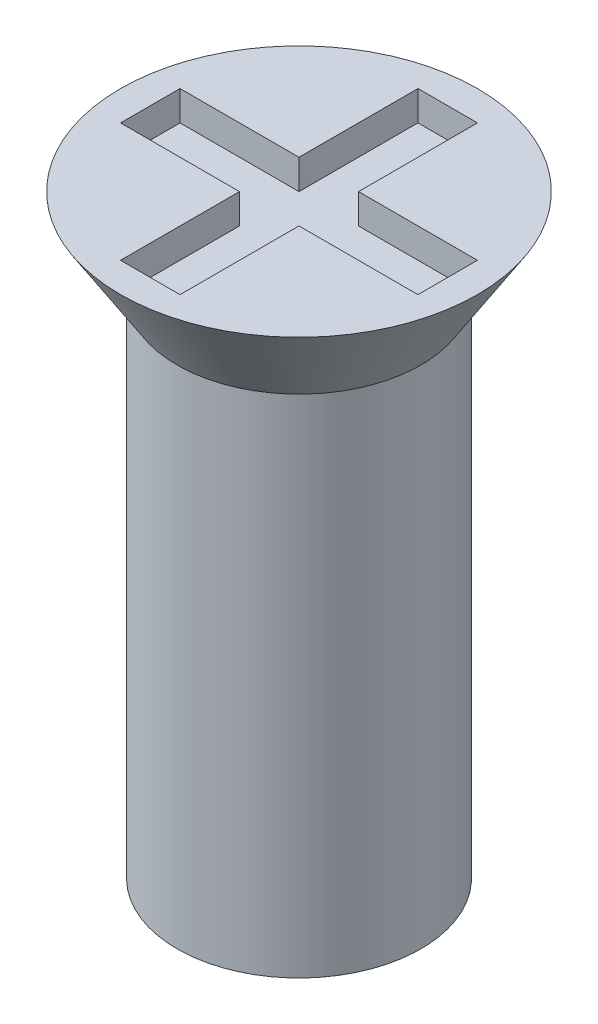
ISO-10303-21;
HEADER;
FILE_DESCRIPTION(('STEP AP214'),'2;1');
FILE_NAME('part.step','',(''),(''),'','','');
FILE_SCHEMA(('AUTOMOTIVE_DESIGN { 1 0 10303 214 1 1 1 1 }'));
ENDSEC;
DATA;
#1=APPLICATION_CONTEXT('core data for automotive mechanical design processes');
#2=APPLICATION_PROTOCOL_DEFINITION('international standard','automotive_design',2000,#1);
#3=PRODUCT_CONTEXT('',#1,'mechanical');
#4=PRODUCT('Part','Part','',(#3));
#5=PRODUCT_RELATED_PRODUCT_CATEGORY('part','',(#4));
#6=PRODUCT_DEFINITION_FORMATION('','',#4);
#7=PRODUCT_DEFINITION_CONTEXT('part definition',#1,'design');
#8=PRODUCT_DEFINITION('design','',#6,#7);
#9=PRODUCT_DEFINITION_SHAPE('','',#8);
#10=(LENGTH_UNIT() NAMED_UNIT(*) SI_UNIT(.MILLI.,.METRE.));
#11=(NAMED_UNIT(*) PLANE_ANGLE_UNIT() SI_UNIT($,.RADIAN.));
#12=(NAMED_UNIT(*) SI_UNIT($,.STERADIAN.) SOLID_ANGLE_UNIT());
#13=UNCERTAINTY_MEASURE_WITH_UNIT(LENGTH_MEASURE(1.E-05),#10,'distance_accuracy_value','');
#14=(GEOMETRIC_REPRESENTATION_CONTEXT(3) GLOBAL_UNCERTAINTY_ASSIGNED_CONTEXT((#13)) GLOBAL_UNIT_ASSIGNED_CONTEXT((#10,
#11,#12)) REPRESENTATION_CONTEXT('',''));
#15=CARTESIAN_POINT('',(0.,0.,0.));
#16=DIRECTION('',(0.,0.,1.));
#17=DIRECTION('',(1.,0.,0.));
#18=AXIS2_PLACEMENT_3D('',#15,#16,#17);
#19=CARTESIAN_POINT('',(-2.5,-0.5,0.5));
#20=DIRECTION('',(0.,0.,1.));
#21=DIRECTION('',(1.,0.,0.));
#22=AXIS2_PLACEMENT_3D('',#19,#20,#21);
#23=PLANE('',#22);
#24=DIRECTION('',(1.,0.,0.));
#25=VECTOR('',#24,1.);
#26=CARTESIAN_POINT('',(-2.5,-0.5,0.5));
#27=LINE('',#26,#25);
#28=CARTESIAN_POINT('',(0.5,-0.5,0.5));
#29=VERTEX_POINT('',#28);
#30=CARTESIAN_POINT('',(2.5,-0.5,0.5));
#31=VERTEX_POINT('',#30);
#32=EDGE_CURVE('E137',#29,#31,#27,.T.);
#33=ORIENTED_EDGE('',*,*,#32,.F.);
#34=DIRECTION('',(0.,1.,0.));
#35=VECTOR('',#34,1.);
#36=CARTESIAN_POINT('',(0.5,-0.5,0.5));
#37=LINE('',#36,#35);
#38=CARTESIAN_POINT('',(0.5,0.,0.5));
#39=VERTEX_POINT('',#38);
#40=EDGE_CURVE('E126',#29,#39,#37,.T.);
#41=ORIENTED_EDGE('',*,*,#40,.T.);
#42=DIRECTION('',(1.,0.,0.));
#43=VECTOR('',#42,1.);
#44=CARTESIAN_POINT('',(-2.5,0.,0.5));
#45=LINE('',#44,#43);
#46=CARTESIAN_POINT('',(2.5,0.,0.5));
#47=VERTEX_POINT('',#46);
#48=EDGE_CURVE('E155',#39,#47,#45,.T.);
#49=ORIENTED_EDGE('',*,*,#48,.T.);
#50=DIRECTION('',(0.,1.,0.));
#51=VECTOR('',#50,1.);
#52=CARTESIAN_POINT('',(2.5,-0.5,0.5));
#53=LINE('',#52,#51);
#54=EDGE_CURVE('E156',#31,#47,#53,.T.);
#55=ORIENTED_EDGE('',*,*,#54,.F.);
#56=EDGE_LOOP('',(#33,#41,#49,#55));
#57=FACE_BOUND('',#56,.T.);
#58=ADVANCED_FACE('F17',(#57),#23,.F.);
#59=CARTESIAN_POINT('',(-2.5,-0.5,-0.5));
#60=DIRECTION('',(0.,0.,-1.));
#61=DIRECTION('',(-1.,0.,0.));
#62=AXIS2_PLACEMENT_3D('',#59,#60,#61);
#63=PLANE('',#62);
#64=DIRECTION('',(-1.,0.,0.));
#65=VECTOR('',#64,1.);
#66=CARTESIAN_POINT('',(-2.5,0.,-0.5));
#67=LINE('',#66,#65);
#68=CARTESIAN_POINT('',(2.5,0.,-0.5));
#69=VERTEX_POINT('',#68);
#70=CARTESIAN_POINT('',(0.5,0.,-0.5));
#71=VERTEX_POINT('',#70);
#72=EDGE_CURVE('E124',#69,#71,#67,.T.);
#73=ORIENTED_EDGE('',*,*,#72,.T.);
#74=DIRECTION('',(0.,-1.,0.));
#75=VECTOR('',#74,1.);
#76=CARTESIAN_POINT('',(0.5,-0.5,-0.5));
#77=LINE('',#76,#75);
#78=CARTESIAN_POINT('',(0.5,-0.5,-0.5));
#79=VERTEX_POINT('',#78);
#80=EDGE_CURVE('E108',#71,#79,#77,.T.);
#81=ORIENTED_EDGE('',*,*,#80,.T.);
#82=DIRECTION('',(-1.,0.,0.));
#83=VECTOR('',#82,1.);
#84=CARTESIAN_POINT('',(-2.5,-0.5,-0.5));
#85=LINE('',#84,#83);
#86=CARTESIAN_POINT('',(2.5,-0.5,-0.5));
#87=VERTEX_POINT('',#86);
#88=EDGE_CURVE('E125',#87,#79,#85,.T.);
#89=ORIENTED_EDGE('',*,*,#88,.F.);
#90=DIRECTION('',(0.,1.,0.));
#91=VECTOR('',#90,1.);
#92=CARTESIAN_POINT('',(2.5,-0.5,-0.5));
#93=LINE('',#92,#91);
#94=EDGE_CURVE('E145',#87,#69,#93,.T.);
#95=ORIENTED_EDGE('',*,*,#94,.T.);
#96=EDGE_LOOP('',(#73,#81,#89,#95));
#97=FACE_BOUND('',#96,.T.);
#98=ADVANCED_FACE('F120',(#97),#63,.F.);
#99=CARTESIAN_POINT('',(0.,0.,0.));
#100=DIRECTION('',(0.,1.,0.));
#101=DIRECTION('',(-1.,0.,0.));
#102=AXIS2_PLACEMENT_3D('',#99,#100,#101);
#103=PLANE('',#102);
#104=DIRECTION('',(0.,0.,-1.));
#105=VECTOR('',#104,1.);
#106=CARTESIAN_POINT('',(0.500000000000009,0.,2.5));
#107=LINE('',#106,#105);
#108=CARTESIAN_POINT('',(0.499999999999991,0.,-2.5));
#109=VERTEX_POINT('',#108);
#110=EDGE_CURVE('E234',#71,#109,#107,.T.);
#111=ORIENTED_EDGE('',*,*,#110,.F.);
#112=ORIENTED_EDGE('',*,*,#72,.F.);
#113=DIRECTION('',(0.,0.,-1.));
#114=VECTOR('',#113,1.);
#115=CARTESIAN_POINT('',(2.5,0.,0.5));
#116=LINE('',#115,#114);
#117=EDGE_CURVE('E144',#47,#69,#116,.T.);
#118=ORIENTED_EDGE('',*,*,#117,.F.);
#119=ORIENTED_EDGE('',*,*,#48,.F.);
#120=CARTESIAN_POINT('',(0.500000000000009,0.,2.5));
#121=VERTEX_POINT('',#120);
#122=EDGE_CURVE('E240',#121,#39,#107,.T.);
#123=ORIENTED_EDGE('',*,*,#122,.F.);
#124=DIRECTION('',(1.,0.,0.));
#125=VECTOR('',#124,1.);
#126=CARTESIAN_POINT('',(0.500000000000009,0.,2.5));
#127=LINE('',#126,#125);
#128=CARTESIAN_POINT('',(-0.499999999999991,0.,2.5));
#129=VERTEX_POINT('',#128);
#130=EDGE_CURVE('E224',#129,#121,#127,.T.);
#131=ORIENTED_EDGE('',*,*,#130,.F.);
#132=DIRECTION('',(0.,0.,1.));
#133=VECTOR('',#132,1.);
#134=CARTESIAN_POINT('',(-0.499999999999991,0.,2.5));
#135=LINE('',#134,#133);
#136=CARTESIAN_POINT('',(-0.5,0.,0.5));
#137=VERTEX_POINT('',#136);
#138=EDGE_CURVE('E219',#137,#129,#135,.T.);
#139=ORIENTED_EDGE('',*,*,#138,.F.);
#140=CARTESIAN_POINT('',(-2.5,0.,0.5));
#141=VERTEX_POINT('',#140);
#142=EDGE_CURVE('E153',#141,#137,#45,.T.);
#143=ORIENTED_EDGE('',*,*,#142,.F.);
#144=DIRECTION('',(0.,0.,1.));
#145=VECTOR('',#144,1.);
#146=CARTESIAN_POINT('',(-2.5,0.,0.5));
#147=LINE('',#146,#145);
#148=CARTESIAN_POINT('',(-2.5,0.,-0.5));
#149=VERTEX_POINT('',#148);
#150=EDGE_CURVE('E149',#149,#141,#147,.T.);
#151=ORIENTED_EDGE('',*,*,#150,.F.);
#152=CARTESIAN_POINT('',(-0.5,0.,-0.5));
#153=VERTEX_POINT('',#152);
#154=EDGE_CURVE('E150',#153,#149,#67,.T.);
#155=ORIENTED_EDGE('',*,*,#154,.F.);
#156=CARTESIAN_POINT('',(-0.500000000000009,0.,-2.5));
#157=VERTEX_POINT('',#156);
#158=EDGE_CURVE('E227',#157,#153,#135,.T.);
#159=ORIENTED_EDGE('',*,*,#158,.F.);
#160=DIRECTION('',(-1.,0.,0.));
#161=VECTOR('',#160,1.);
#162=CARTESIAN_POINT('',(0.499999999999991,0.,-2.5));
#163=LINE('',#162,#161);
#164=EDGE_CURVE('E229',#109,#157,#163,.T.);
#165=ORIENTED_EDGE('',*,*,#164,.F.);
#166=EDGE_LOOP('',(#111,#112,#118,#119,#123,#131,#139,#143,#151,#155,#159,#165));
#167=FACE_BOUND('',#166,.T.);
#168=CARTESIAN_POINT('',(0.,0.,0.));
#169=DIRECTION('',(0.,1.,0.));
#170=DIRECTION('',(-1.,0.,0.));
#171=AXIS2_PLACEMENT_3D('',#168,#169,#170);
#172=CIRCLE('',#171,3.);
#173=CARTESIAN_POINT('',(-3.,0.,0.));
#174=VERTEX_POINT('',#173);
#175=EDGE_CURVE('E11',#174,#174,#172,.T.);
#176=ORIENTED_EDGE('',*,*,#175,.T.);
#177=EDGE_LOOP('',(#176));
#178=FACE_BOUND('',#177,.T.);
#179=ADVANCED_FACE('F19',(#167,#178),#103,.T.);
#180=CARTESIAN_POINT('',(0.,0.,0.));
#181=DIRECTION('',(0.,1.,0.));
#182=DIRECTION('',(-1.,0.,0.));
#183=AXIS2_PLACEMENT_3D('',#180,#181,#182);
#184=CONICAL_SURFACE('',#183,3.,0.5645693936681);
#185=CARTESIAN_POINT('',(0.,-1.5,0.));
#186=DIRECTION('',(0.,1.,0.));
#187=DIRECTION('',(-1.,0.,0.));
#188=AXIS2_PLACEMENT_3D('',#185,#186,#187);
#189=CIRCLE('',#188,2.05);
#190=CARTESIAN_POINT('',(-2.05,-1.5,0.));
#191=VERTEX_POINT('',#190);
#192=EDGE_CURVE('E25',#191,#191,#189,.T.);
#193=ORIENTED_EDGE('',*,*,#192,.T.);
#194=EDGE_LOOP('',(#193));
#195=FACE_BOUND('',#194,.T.);
#196=ORIENTED_EDGE('',*,*,#175,.F.);
#197=EDGE_LOOP('',(#196));
#198=FACE_BOUND('',#197,.T.);
#199=ADVANCED_FACE('F168',(#195,#198),#184,.T.);
#200=CARTESIAN_POINT('',(0.,0.,0.));
#201=DIRECTION('',(0.,1.,0.));
#202=DIRECTION('',(-1.,0.,0.));
#203=AXIS2_PLACEMENT_3D('',#200,#201,#202);
#204=CYLINDRICAL_SURFACE('',#203,2.05);
#205=CARTESIAN_POINT('',(0.,-10.,0.));
#206=DIRECTION('',(0.,1.,0.));
#207=DIRECTION('',(-1.,0.,0.));
#208=AXIS2_PLACEMENT_3D('',#205,#206,#207);
#209=CIRCLE('',#208,2.05);
#210=CARTESIAN_POINT('',(-2.05,-10.,0.));
#211=VERTEX_POINT('',#210);
#212=EDGE_CURVE('E157',#211,#211,#209,.T.);
#213=ORIENTED_EDGE('',*,*,#212,.T.);
#214=EDGE_LOOP('',(#213));
#215=FACE_BOUND('',#214,.T.);
#216=ORIENTED_EDGE('',*,*,#192,.F.);
#217=EDGE_LOOP('',(#216));
#218=FACE_BOUND('',#217,.T.);
#219=ADVANCED_FACE('F174',(#215,#218),#204,.T.);
#220=CARTESIAN_POINT('',(-2.05,-10.,0.));
#221=DIRECTION('',(0.,-1.,0.));
#222=DIRECTION('',(1.,0.,0.));
#223=AXIS2_PLACEMENT_3D('',#220,#221,#222);
#224=PLANE('',#223);
#225=ORIENTED_EDGE('',*,*,#212,.F.);
#226=EDGE_LOOP('',(#225));
#227=FACE_BOUND('',#226,.T.);
#228=ADVANCED_FACE('F175',(#227),#224,.T.);
#229=CARTESIAN_POINT('',(2.5,-0.5,0.5));
#230=DIRECTION('',(1.,0.,0.));
#231=DIRECTION('',(0.,1.,0.));
#232=AXIS2_PLACEMENT_3D('',#229,#230,#231);
#233=PLANE('',#232);
#234=ORIENTED_EDGE('',*,*,#117,.T.);
#235=ORIENTED_EDGE('',*,*,#94,.F.);
#236=DIRECTION('',(0.,0.,-1.));
#237=VECTOR('',#236,1.);
#238=CARTESIAN_POINT('',(2.5,-0.5,0.5));
#239=LINE('',#238,#237);
#240=EDGE_CURVE('E131',#31,#87,#239,.T.);
#241=ORIENTED_EDGE('',*,*,#240,.F.);
#242=ORIENTED_EDGE('',*,*,#54,.T.);
#243=EDGE_LOOP('',(#234,#235,#241,#242));
#244=FACE_BOUND('',#243,.T.);
#245=ADVANCED_FACE('F182',(#244),#233,.F.);
#246=ORIENTED_EDGE('',*,*,#142,.T.);
#247=DIRECTION('',(0.,-1.,0.));
#248=VECTOR('',#247,1.);
#249=CARTESIAN_POINT('',(-0.5,-0.5,0.5));
#250=LINE('',#249,#248);
#251=CARTESIAN_POINT('',(-0.5,-0.5,0.5));
#252=VERTEX_POINT('',#251);
#253=EDGE_CURVE('E130',#137,#252,#250,.T.);
#254=ORIENTED_EDGE('',*,*,#253,.T.);
#255=CARTESIAN_POINT('',(-2.5,-0.5,0.5));
#256=VERTEX_POINT('',#255);
#257=EDGE_CURVE('E143',#256,#252,#27,.T.);
#258=ORIENTED_EDGE('',*,*,#257,.F.);
#259=DIRECTION('',(0.,1.,0.));
#260=VECTOR('',#259,1.);
#261=CARTESIAN_POINT('',(-2.5,-0.5,0.5));
#262=LINE('',#261,#260);
#263=EDGE_CURVE('E159',#256,#141,#262,.T.);
#264=ORIENTED_EDGE('',*,*,#263,.T.);
#265=EDGE_LOOP('',(#246,#254,#258,#264));
#266=FACE_BOUND('',#265,.T.);
#267=ADVANCED_FACE('F189',(#266),#23,.F.);
#268=CARTESIAN_POINT('',(-2.5,-0.5,0.5));
#269=DIRECTION('',(-1.,0.,0.));
#270=DIRECTION('',(0.,-1.,0.));
#271=AXIS2_PLACEMENT_3D('',#268,#269,#270);
#272=PLANE('',#271);
#273=ORIENTED_EDGE('',*,*,#150,.T.);
#274=ORIENTED_EDGE('',*,*,#263,.F.);
#275=DIRECTION('',(0.,0.,1.));
#276=VECTOR('',#275,1.);
#277=CARTESIAN_POINT('',(-2.5,-0.5,0.5));
#278=LINE('',#277,#276);
#279=CARTESIAN_POINT('',(-2.5,-0.5,-0.5));
#280=VERTEX_POINT('',#279);
#281=EDGE_CURVE('E135',#280,#256,#278,.T.);
#282=ORIENTED_EDGE('',*,*,#281,.F.);
#283=DIRECTION('',(0.,1.,0.));
#284=VECTOR('',#283,1.);
#285=CARTESIAN_POINT('',(-2.5,-0.5,-0.5));
#286=LINE('',#285,#284);
#287=EDGE_CURVE('E165',#280,#149,#286,.T.);
#288=ORIENTED_EDGE('',*,*,#287,.T.);
#289=EDGE_LOOP('',(#273,#274,#282,#288));
#290=FACE_BOUND('',#289,.T.);
#291=ADVANCED_FACE('F203',(#290),#272,.F.);
#292=CARTESIAN_POINT('',(-0.5,-0.5,-0.5));
#293=VERTEX_POINT('',#292);
#294=EDGE_CURVE('E132',#293,#280,#85,.T.);
#295=ORIENTED_EDGE('',*,*,#294,.F.);
#296=DIRECTION('',(0.,1.,0.));
#297=VECTOR('',#296,1.);
#298=CARTESIAN_POINT('',(-0.5,-0.5,-0.5));
#299=LINE('',#298,#297);
#300=EDGE_CURVE('E231',#293,#153,#299,.T.);
#301=ORIENTED_EDGE('',*,*,#300,.T.);
#302=ORIENTED_EDGE('',*,*,#154,.T.);
#303=ORIENTED_EDGE('',*,*,#287,.F.);
#304=EDGE_LOOP('',(#295,#301,#302,#303));
#305=FACE_BOUND('',#304,.T.);
#306=ADVANCED_FACE('F198',(#305),#63,.F.);
#307=CARTESIAN_POINT('',(0.,-0.5,0.));
#308=DIRECTION('',(0.,-1.,0.));
#309=DIRECTION('',(1.,0.,0.));
#310=AXIS2_PLACEMENT_3D('',#307,#308,#309);
#311=PLANE('',#310);
#312=ORIENTED_EDGE('',*,*,#240,.T.);
#313=ORIENTED_EDGE('',*,*,#88,.T.);
#314=DIRECTION('',(0.,0.,-1.));
#315=VECTOR('',#314,1.);
#316=CARTESIAN_POINT('',(0.500000000000009,-0.5,2.5));
#317=LINE('',#316,#315);
#318=CARTESIAN_POINT('',(0.499999999999991,-0.5,-2.5));
#319=VERTEX_POINT('',#318);
#320=EDGE_CURVE('E106',#79,#319,#317,.T.);
#321=ORIENTED_EDGE('',*,*,#320,.T.);
#322=DIRECTION('',(-1.,0.,0.));
#323=VECTOR('',#322,1.);
#324=CARTESIAN_POINT('',(0.499999999999991,-0.5,-2.5));
#325=LINE('',#324,#323);
#326=CARTESIAN_POINT('',(-0.500000000000009,-0.5,-2.5));
#327=VERTEX_POINT('',#326);
#328=EDGE_CURVE('E238',#319,#327,#325,.T.);
#329=ORIENTED_EDGE('',*,*,#328,.T.);
#330=DIRECTION('',(0.,0.,1.));
#331=VECTOR('',#330,1.);
#332=CARTESIAN_POINT('',(-0.499999999999991,-0.5,2.5));
#333=LINE('',#332,#331);
#334=EDGE_CURVE('E39',#327,#293,#333,.T.);
#335=ORIENTED_EDGE('',*,*,#334,.T.);
#336=ORIENTED_EDGE('',*,*,#294,.T.);
#337=ORIENTED_EDGE('',*,*,#281,.T.);
#338=ORIENTED_EDGE('',*,*,#257,.T.);
#339=CARTESIAN_POINT('',(-0.499999999999991,-0.5,2.5));
#340=VERTEX_POINT('',#339);
#341=EDGE_CURVE('E249',#252,#340,#333,.T.);
#342=ORIENTED_EDGE('',*,*,#341,.T.);
#343=DIRECTION('',(1.,0.,0.));
#344=VECTOR('',#343,1.);
#345=CARTESIAN_POINT('',(0.500000000000009,-0.5,2.5));
#346=LINE('',#345,#344);
#347=CARTESIAN_POINT('',(0.500000000000009,-0.5,2.5));
#348=VERTEX_POINT('',#347);
#349=EDGE_CURVE('E113',#340,#348,#346,.T.);
#350=ORIENTED_EDGE('',*,*,#349,.T.);
#351=EDGE_CURVE('E32',#348,#29,#317,.T.);
#352=ORIENTED_EDGE('',*,*,#351,.T.);
#353=ORIENTED_EDGE('',*,*,#32,.T.);
#354=EDGE_LOOP('',(#312,#313,#321,#329,#335,#336,#337,#338,#342,#350,#352,#353));
#355=FACE_BOUND('',#354,.T.);
#356=ADVANCED_FACE('F127',(#355),#311,.F.);
#357=CARTESIAN_POINT('',(-0.499999999999991,-0.5,2.5));
#358=DIRECTION('',(-1.,0.,0.));
#359=DIRECTION('',(0.,0.,1.));
#360=AXIS2_PLACEMENT_3D('',#357,#358,#359);
#361=PLANE('',#360);
#362=ORIENTED_EDGE('',*,*,#300,.F.);
#363=ORIENTED_EDGE('',*,*,#334,.F.);
#364=DIRECTION('',(0.,1.,0.));
#365=VECTOR('',#364,1.);
#366=CARTESIAN_POINT('',(-0.500000000000009,-0.5,-2.5));
#367=LINE('',#366,#365);
#368=EDGE_CURVE('E242',#327,#157,#367,.T.);
#369=ORIENTED_EDGE('',*,*,#368,.T.);
#370=ORIENTED_EDGE('',*,*,#158,.T.);
#371=EDGE_LOOP('',(#362,#363,#369,#370));
#372=FACE_BOUND('',#371,.T.);
#373=ADVANCED_FACE('F265',(#372),#361,.F.);
#374=CARTESIAN_POINT('',(0.500000000000009,-0.5,2.5));
#375=DIRECTION('',(1.,0.,0.));
#376=DIRECTION('',(0.,0.,-1.));
#377=AXIS2_PLACEMENT_3D('',#374,#375,#376);
#378=PLANE('',#377);
#379=ORIENTED_EDGE('',*,*,#80,.F.);
#380=ORIENTED_EDGE('',*,*,#110,.T.);
#381=DIRECTION('',(0.,1.,0.));
#382=VECTOR('',#381,1.);
#383=CARTESIAN_POINT('',(0.499999999999991,-0.5,-2.5));
#384=LINE('',#383,#382);
#385=EDGE_CURVE('E115',#319,#109,#384,.T.);
#386=ORIENTED_EDGE('',*,*,#385,.F.);
#387=ORIENTED_EDGE('',*,*,#320,.F.);
#388=EDGE_LOOP('',(#379,#380,#386,#387));
#389=FACE_BOUND('',#388,.T.);
#390=ADVANCED_FACE('F107',(#389),#378,.F.);
#391=CARTESIAN_POINT('',(0.499999999999991,-0.5,-2.5));
#392=DIRECTION('',(0.,0.,-1.));
#393=DIRECTION('',(-1.,0.,0.));
#394=AXIS2_PLACEMENT_3D('',#391,#392,#393);
#395=PLANE('',#394);
#396=ORIENTED_EDGE('',*,*,#164,.T.);
#397=ORIENTED_EDGE('',*,*,#368,.F.);
#398=ORIENTED_EDGE('',*,*,#328,.F.);
#399=ORIENTED_EDGE('',*,*,#385,.T.);
#400=EDGE_LOOP('',(#396,#397,#398,#399));
#401=FACE_BOUND('',#400,.T.);
#402=ADVANCED_FACE('F261',(#401),#395,.F.);
#403=ORIENTED_EDGE('',*,*,#40,.F.);
#404=ORIENTED_EDGE('',*,*,#351,.F.);
#405=DIRECTION('',(0.,1.,0.));
#406=VECTOR('',#405,1.);
#407=CARTESIAN_POINT('',(0.500000000000009,-0.5,2.5));
#408=LINE('',#407,#406);
#409=EDGE_CURVE('E239',#348,#121,#408,.T.);
#410=ORIENTED_EDGE('',*,*,#409,.T.);
#411=ORIENTED_EDGE('',*,*,#122,.T.);
#412=EDGE_LOOP('',(#403,#404,#410,#411));
#413=FACE_BOUND('',#412,.T.);
#414=ADVANCED_FACE('F271',(#413),#378,.F.);
#415=CARTESIAN_POINT('',(0.500000000000009,-0.5,2.5));
#416=DIRECTION('',(0.,0.,1.));
#417=DIRECTION('',(1.,0.,0.));
#418=AXIS2_PLACEMENT_3D('',#415,#416,#417);
#419=PLANE('',#418);
#420=ORIENTED_EDGE('',*,*,#130,.T.);
#421=ORIENTED_EDGE('',*,*,#409,.F.);
#422=ORIENTED_EDGE('',*,*,#349,.F.);
#423=DIRECTION('',(0.,1.,0.));
#424=VECTOR('',#423,1.);
#425=CARTESIAN_POINT('',(-0.499999999999991,-0.5,2.5));
#426=LINE('',#425,#424);
#427=EDGE_CURVE('E245',#340,#129,#426,.T.);
#428=ORIENTED_EDGE('',*,*,#427,.T.);
#429=EDGE_LOOP('',(#420,#421,#422,#428));
#430=FACE_BOUND('',#429,.T.);
#431=ADVANCED_FACE('F269',(#430),#419,.F.);
#432=ORIENTED_EDGE('',*,*,#253,.F.);
#433=ORIENTED_EDGE('',*,*,#138,.T.);
#434=ORIENTED_EDGE('',*,*,#427,.F.);
#435=ORIENTED_EDGE('',*,*,#341,.F.);
#436=EDGE_LOOP('',(#432,#433,#434,#435));
#437=FACE_BOUND('',#436,.T.);
#438=ADVANCED_FACE('F268',(#437),#361,.F.);
#439=CLOSED_SHELL('',(#58,#98,#179,#199,#219,#228,#245,#267,#291,#306,#356,#373,#390,#402,#414,
#431,#438));
#440=MANIFOLD_SOLID_BREP('B1',#439);
#441=ADVANCED_BREP_SHAPE_REPRESENTATION('',(#18,#440),#14);
#442=SHAPE_DEFINITION_REPRESENTATION(#9,#441);
ENDSEC;
END-ISO-10303-21;
